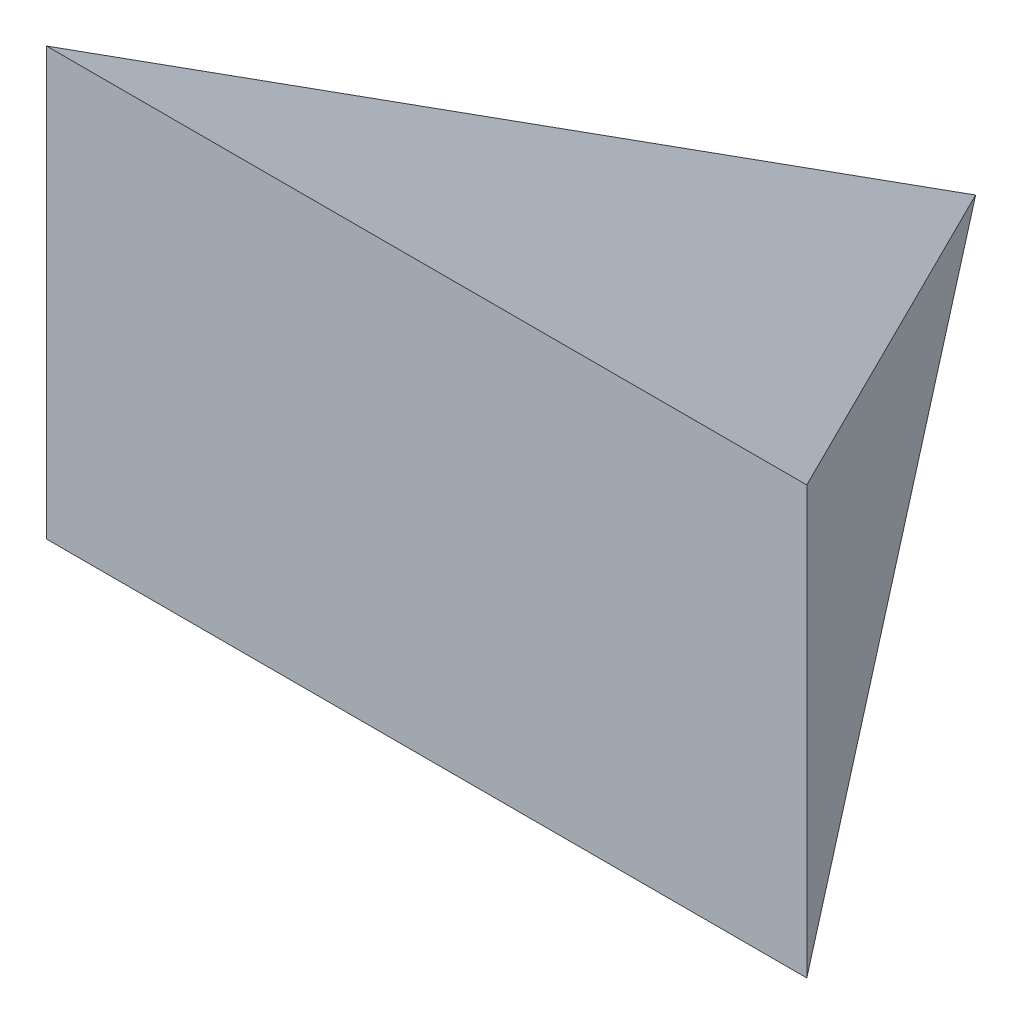
ISO-10303-21;
HEADER;
FILE_DESCRIPTION(('STEP AP214'),'2;1');
FILE_NAME('part.step','',(''),(''),'','','');
FILE_SCHEMA(('AUTOMOTIVE_DESIGN { 1 0 10303 214 1 1 1 1 }'));
ENDSEC;
DATA;
#1=APPLICATION_CONTEXT('core data for automotive mechanical design processes');
#2=APPLICATION_PROTOCOL_DEFINITION('international standard','automotive_design',2000,#1);
#3=PRODUCT_CONTEXT('',#1,'mechanical');
#4=PRODUCT('Part','Part','',(#3));
#5=PRODUCT_RELATED_PRODUCT_CATEGORY('part','',(#4));
#6=PRODUCT_DEFINITION_FORMATION('','',#4);
#7=PRODUCT_DEFINITION_CONTEXT('part definition',#1,'design');
#8=PRODUCT_DEFINITION('design','',#6,#7);
#9=PRODUCT_DEFINITION_SHAPE('','',#8);
#10=(LENGTH_UNIT() NAMED_UNIT(*) SI_UNIT(.MILLI.,.METRE.));
#11=(NAMED_UNIT(*) PLANE_ANGLE_UNIT() SI_UNIT($,.RADIAN.));
#12=(NAMED_UNIT(*) SI_UNIT($,.STERADIAN.) SOLID_ANGLE_UNIT());
#13=UNCERTAINTY_MEASURE_WITH_UNIT(LENGTH_MEASURE(1.E-05),#10,'distance_accuracy_value','');
#14=(GEOMETRIC_REPRESENTATION_CONTEXT(3) GLOBAL_UNCERTAINTY_ASSIGNED_CONTEXT((#13)) GLOBAL_UNIT_ASSIGNED_CONTEXT((#10,
#11,#12)) REPRESENTATION_CONTEXT('',''));
#15=CARTESIAN_POINT('',(0.,0.,0.));
#16=DIRECTION('',(0.,0.,1.));
#17=DIRECTION('',(1.,0.,0.));
#18=AXIS2_PLACEMENT_3D('',#15,#16,#17);
#19=CARTESIAN_POINT('',(38.9,3.6,-0.1));
#20=DIRECTION('',(0.822144041030737,0.,-0.569279523430845));
#21=DIRECTION('',(-0.569279523430845,0.,-0.822144041030737));
#22=AXIS2_PLACEMENT_3D('',#19,#20,#21);
#23=PLANE('',#22);
#24=DIRECTION('',(0.,1.,0.));
#25=VECTOR('',#24,1.);
#26=CARTESIAN_POINT('',(38.9,3.6,-0.1));
#27=LINE('',#26,#25);
#28=CARTESIAN_POINT('',(38.8999999999999,-3.6,-0.1));
#29=VERTEX_POINT('',#28);
#30=CARTESIAN_POINT('',(38.9,3.6,-0.1));
#31=VERTEX_POINT('',#30);
#32=EDGE_CURVE('E95',#29,#31,#27,.T.);
#33=ORIENTED_EDGE('',*,*,#32,.T.);
#34=DIRECTION('',(-0.542240510339194,-0.304528892139205,-0.783094747013131));
#35=VECTOR('',#34,1.);
#36=CARTESIAN_POINT('',(38.9,3.6,-0.1));
#37=LINE('',#36,#35);
#38=CARTESIAN_POINT('',(6963.22828093152,3892.3873185299,9999.9));
#39=VERTEX_POINT('',#38);
#40=EDGE_CURVE('E55',#31,#39,#37,.F.);
#41=ORIENTED_EDGE('',*,*,#40,.T.);
#42=DIRECTION('',(0.,-1.,0.));
#43=VECTOR('',#42,1.);
#44=CARTESIAN_POINT('',(6963.22828093152,3.6,9999.9));
#45=LINE('',#44,#43);
#46=CARTESIAN_POINT('',(6963.22828093152,-3892.38731852991,9999.9));
#47=VERTEX_POINT('',#46);
#48=EDGE_CURVE('E40',#47,#39,#45,.F.);
#49=ORIENTED_EDGE('',*,*,#48,.F.);
#50=DIRECTION('',(0.542240510339194,-0.304528892139205,0.783094747013131));
#51=VECTOR('',#50,1.);
#52=CARTESIAN_POINT('',(37.7110791064165,-2.93228750773777,-1.81701982538517));
#53=LINE('',#52,#51);
#54=EDGE_CURVE('E71',#47,#29,#53,.F.);
#55=ORIENTED_EDGE('',*,*,#54,.T.);
#56=EDGE_LOOP('',(#33,#41,#49,#55));
#57=FACE_BOUND('',#56,.T.);
#58=ADVANCED_FACE('F32',(#57),#23,.T.);
#59=CARTESIAN_POINT('',(26.1,3.6,-0.1));
#60=DIRECTION('',(-0.822144041030737,0.,-0.569279523430845));
#61=DIRECTION('',(-0.569279523430845,0.,0.822144041030737));
#62=AXIS2_PLACEMENT_3D('',#59,#60,#61);
#63=PLANE('',#62);
#64=DIRECTION('',(0.,1.,0.));
#65=VECTOR('',#64,1.);
#66=CARTESIAN_POINT('',(-6898.22828093152,3.6,9999.9));
#67=LINE('',#66,#65);
#68=CARTESIAN_POINT('',(-6898.22828093152,3892.3873185299,9999.9));
#69=VERTEX_POINT('',#68);
#70=CARTESIAN_POINT('',(-6898.22828093152,-3892.38731852991,9999.9));
#71=VERTEX_POINT('',#70);
#72=EDGE_CURVE('E11',#69,#71,#67,.F.);
#73=ORIENTED_EDGE('',*,*,#72,.F.);
#74=DIRECTION('',(-0.542240510339194,0.304528892139205,0.783094747013131));
#75=VECTOR('',#74,1.);
#76=CARTESIAN_POINT('',(26.1,3.6,-0.1));
#77=LINE('',#76,#75);
#78=CARTESIAN_POINT('',(26.0999999999996,3.6,-0.1));
#79=VERTEX_POINT('',#78);
#80=EDGE_CURVE('E98',#69,#79,#77,.F.);
#81=ORIENTED_EDGE('',*,*,#80,.T.);
#82=DIRECTION('',(0.,-1.,0.));
#83=VECTOR('',#82,1.);
#84=CARTESIAN_POINT('',(26.1,3.6,-0.1));
#85=LINE('',#84,#83);
#86=CARTESIAN_POINT('',(26.1,-3.6,-0.1));
#87=VERTEX_POINT('',#86);
#88=EDGE_CURVE('E89',#79,#87,#85,.T.);
#89=ORIENTED_EDGE('',*,*,#88,.T.);
#90=DIRECTION('',(0.542240510339194,0.304528892139205,-0.783094747013131));
#91=VECTOR('',#90,1.);
#92=CARTESIAN_POINT('',(27.2889208935835,-2.93228750773777,-1.81701982538517));
#93=LINE('',#92,#91);
#94=EDGE_CURVE('E47',#87,#71,#93,.F.);
#95=ORIENTED_EDGE('',*,*,#94,.T.);
#96=EDGE_LOOP('',(#73,#81,#89,#95));
#97=FACE_BOUND('',#96,.T.);
#98=ADVANCED_FACE('F34',(#97),#63,.T.);
#99=CARTESIAN_POINT('',(0.,0.,9999.9));
#100=DIRECTION('',(0.,0.,1.));
#101=DIRECTION('',(1.,0.,0.));
#102=AXIS2_PLACEMENT_3D('',#99,#100,#101);
#103=PLANE('',#102);
#104=DIRECTION('',(1.,0.,0.));
#105=VECTOR('',#104,1.);
#106=CARTESIAN_POINT('',(0.,3892.3873185299,9999.9));
#107=LINE('',#106,#105);
#108=EDGE_CURVE('E81',#69,#39,#107,.T.);
#109=ORIENTED_EDGE('',*,*,#108,.F.);
#110=ORIENTED_EDGE('',*,*,#72,.T.);
#111=DIRECTION('',(-1.,0.,0.));
#112=VECTOR('',#111,1.);
#113=CARTESIAN_POINT('',(0.,-3892.38731852991,9999.9));
#114=LINE('',#113,#112);
#115=EDGE_CURVE('E74',#47,#71,#114,.T.);
#116=ORIENTED_EDGE('',*,*,#115,.F.);
#117=ORIENTED_EDGE('',*,*,#48,.T.);
#118=EDGE_LOOP('',(#109,#110,#116,#117));
#119=FACE_BOUND('',#118,.T.);
#120=ADVANCED_FACE('F86',(#119),#103,.T.);
#121=CARTESIAN_POINT('',(0.,0.,-0.1));
#122=DIRECTION('',(0.,0.,1.));
#123=DIRECTION('',(1.,0.,0.));
#124=AXIS2_PLACEMENT_3D('',#121,#122,#123);
#125=PLANE('',#124);
#126=ORIENTED_EDGE('',*,*,#32,.F.);
#127=DIRECTION('',(1.,0.,0.));
#128=VECTOR('',#127,1.);
#129=CARTESIAN_POINT('',(26.1,-3.6,-0.1));
#130=LINE('',#129,#128);
#131=EDGE_CURVE('E76',#87,#29,#130,.T.);
#132=ORIENTED_EDGE('',*,*,#131,.F.);
#133=ORIENTED_EDGE('',*,*,#88,.F.);
#134=DIRECTION('',(-1.,0.,0.));
#135=VECTOR('',#134,1.);
#136=CARTESIAN_POINT('',(26.1,3.6,-0.1));
#137=LINE('',#136,#135);
#138=EDGE_CURVE('E93',#31,#79,#137,.T.);
#139=ORIENTED_EDGE('',*,*,#138,.F.);
#140=EDGE_LOOP('',(#126,#132,#133,#139));
#141=FACE_BOUND('',#140,.T.);
#142=ADVANCED_FACE('F105',(#141),#125,.F.);
#143=CARTESIAN_POINT('',(-6898.22828093152,-3.6,-0.1));
#144=DIRECTION('',(0.,0.932007869282798,0.362438038283703));
#145=DIRECTION('',(0.,-0.362438038283703,0.932007869282798));
#146=AXIS2_PLACEMENT_3D('',#143,#144,#145);
#147=PLANE('',#146);
#148=ORIENTED_EDGE('',*,*,#115,.T.);
#149=ORIENTED_EDGE('',*,*,#94,.F.);
#150=ORIENTED_EDGE('',*,*,#131,.T.);
#151=ORIENTED_EDGE('',*,*,#54,.F.);
#152=EDGE_LOOP('',(#148,#149,#150,#151));
#153=FACE_BOUND('',#152,.T.);
#154=ADVANCED_FACE('F73',(#153),#147,.F.);
#155=CARTESIAN_POINT('',(-6898.22828093152,3.6,-0.1));
#156=DIRECTION('',(0.,-0.932007869282798,0.362438038283702));
#157=DIRECTION('',(0.,-0.362438038283702,-0.932007869282798));
#158=AXIS2_PLACEMENT_3D('',#155,#156,#157);
#159=PLANE('',#158);
#160=ORIENTED_EDGE('',*,*,#138,.T.);
#161=ORIENTED_EDGE('',*,*,#80,.F.);
#162=ORIENTED_EDGE('',*,*,#108,.T.);
#163=ORIENTED_EDGE('',*,*,#40,.F.);
#164=EDGE_LOOP('',(#160,#161,#162,#163));
#165=FACE_BOUND('',#164,.T.);
#166=ADVANCED_FACE('F106',(#165),#159,.F.);
#167=CLOSED_SHELL('',(#58,#98,#120,#142,#154,#166));
#168=MANIFOLD_SOLID_BREP('B2',#167);
#169=ADVANCED_BREP_SHAPE_REPRESENTATION('',(#18,#168),#14);
#170=SHAPE_DEFINITION_REPRESENTATION(#9,#169);
ENDSEC;
END-ISO-10303-21;
